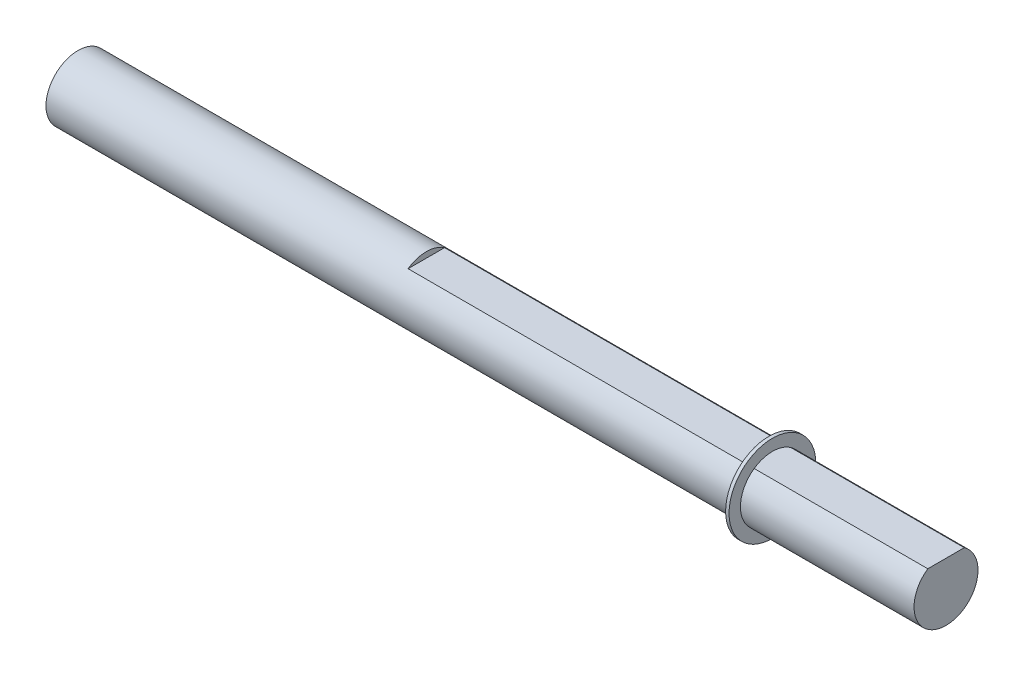
ISO-10303-21;
HEADER;
FILE_DESCRIPTION(('STEP AP214'),'2;1');
FILE_NAME('part.step','',(''),(''),'','','');
FILE_SCHEMA(('AUTOMOTIVE_DESIGN { 1 0 10303 214 1 1 1 1 }'));
ENDSEC;
DATA;
#1=APPLICATION_CONTEXT('core data for automotive mechanical design processes');
#2=APPLICATION_PROTOCOL_DEFINITION('international standard','automotive_design',2000,#1);
#3=PRODUCT_CONTEXT('',#1,'mechanical');
#4=PRODUCT('Part','Part','',(#3));
#5=PRODUCT_RELATED_PRODUCT_CATEGORY('part','',(#4));
#6=PRODUCT_DEFINITION_FORMATION('','',#4);
#7=PRODUCT_DEFINITION_CONTEXT('part definition',#1,'design');
#8=PRODUCT_DEFINITION('design','',#6,#7);
#9=PRODUCT_DEFINITION_SHAPE('','',#8);
#10=(LENGTH_UNIT() NAMED_UNIT(*) SI_UNIT(.MILLI.,.METRE.));
#11=(NAMED_UNIT(*) PLANE_ANGLE_UNIT() SI_UNIT($,.RADIAN.));
#12=(NAMED_UNIT(*) SI_UNIT($,.STERADIAN.) SOLID_ANGLE_UNIT());
#13=UNCERTAINTY_MEASURE_WITH_UNIT(LENGTH_MEASURE(1.E-05),#10,'distance_accuracy_value','');
#14=(GEOMETRIC_REPRESENTATION_CONTEXT(3) GLOBAL_UNCERTAINTY_ASSIGNED_CONTEXT((#13)) GLOBAL_UNIT_ASSIGNED_CONTEXT((#10,
#11,#12)) REPRESENTATION_CONTEXT('',''));
#15=CARTESIAN_POINT('',(0.,0.,0.));
#16=DIRECTION('',(0.,0.,1.));
#17=DIRECTION('',(1.,0.,0.));
#18=AXIS2_PLACEMENT_3D('',#15,#16,#17);
#19=CARTESIAN_POINT('',(0.,0.,0.));
#20=DIRECTION('',(1.,0.,0.));
#21=DIRECTION('',(0.,0.,-1.));
#22=AXIS2_PLACEMENT_3D('',#19,#20,#21);
#23=PLANE('',#22);
#24=CARTESIAN_POINT('',(0.,0.,0.));
#25=DIRECTION('',(-1.,0.,0.));
#26=DIRECTION('',(0.,0.,1.));
#27=AXIS2_PLACEMENT_3D('',#24,#25,#26);
#28=CIRCLE('',#27,2.8);
#29=CARTESIAN_POINT('',(0.,0.,2.8));
#30=VERTEX_POINT('',#29);
#31=EDGE_CURVE('E12',#30,#30,#28,.T.);
#32=ORIENTED_EDGE('',*,*,#31,.T.);
#33=EDGE_LOOP('',(#32));
#34=FACE_BOUND('',#33,.T.);
#35=ADVANCED_FACE('F41',(#34),#23,.F.);
#36=CARTESIAN_POINT('',(0.,0.,0.));
#37=DIRECTION('',(-1.,0.,0.));
#38=DIRECTION('',(0.,0.,1.));
#39=AXIS2_PLACEMENT_3D('',#36,#37,#38);
#40=CYLINDRICAL_SURFACE('',#39,2.8);
#41=CARTESIAN_POINT('',(60.5,0.,0.));
#42=DIRECTION('',(-1.,0.,0.));
#43=DIRECTION('',(0.,0.,1.));
#44=AXIS2_PLACEMENT_3D('',#41,#42,#43);
#45=CIRCLE('',#44,2.8);
#46=CARTESIAN_POINT('',(60.5,2.3,-1.59687194226713));
#47=VERTEX_POINT('',#46);
#48=CARTESIAN_POINT('',(60.5,2.3,1.59687194226713));
#49=VERTEX_POINT('',#48);
#50=EDGE_CURVE('E121',#47,#49,#45,.T.);
#51=ORIENTED_EDGE('',*,*,#50,.T.);
#52=DIRECTION('',(1.,0.,0.));
#53=VECTOR('',#52,1.);
#54=CARTESIAN_POINT('',(-3.23264597504892,2.3,1.59687194226713));
#55=LINE('',#54,#53);
#56=CARTESIAN_POINT('',(30.5,2.3,1.59687194226713));
#57=VERTEX_POINT('',#56);
#58=EDGE_CURVE('E56',#57,#49,#55,.T.);
#59=ORIENTED_EDGE('',*,*,#58,.F.);
#60=CARTESIAN_POINT('',(30.5,0.,0.));
#61=DIRECTION('',(1.,0.,0.));
#62=DIRECTION('',(0.,0.,-1.));
#63=AXIS2_PLACEMENT_3D('',#60,#61,#62);
#64=CIRCLE('',#63,2.8);
#65=CARTESIAN_POINT('',(30.5,2.3,-1.59687194226713));
#66=VERTEX_POINT('',#65);
#67=EDGE_CURVE('E109',#57,#66,#64,.F.);
#68=ORIENTED_EDGE('',*,*,#67,.T.);
#69=DIRECTION('',(1.,0.,0.));
#70=VECTOR('',#69,1.);
#71=CARTESIAN_POINT('',(-3.23264597504892,2.3,-1.59687194226713));
#72=LINE('',#71,#70);
#73=EDGE_CURVE('E100',#66,#47,#72,.T.);
#74=ORIENTED_EDGE('',*,*,#73,.T.);
#75=EDGE_LOOP('',(#51,#59,#68,#74));
#76=FACE_BOUND('',#75,.T.);
#77=ORIENTED_EDGE('',*,*,#31,.F.);
#78=EDGE_LOOP('',(#77));
#79=FACE_BOUND('',#78,.T.);
#80=ADVANCED_FACE('F130',(#76,#79),#40,.T.);
#81=CARTESIAN_POINT('',(60.5,3.8,0.));
#82=DIRECTION('',(1.,0.,0.));
#83=DIRECTION('',(0.,0.,-1.));
#84=AXIS2_PLACEMENT_3D('',#81,#82,#83);
#85=PLANE('',#84);
#86=EDGE_CURVE('E49',#49,#47,#45,.T.);
#87=ORIENTED_EDGE('',*,*,#86,.F.);
#88=ORIENTED_EDGE('',*,*,#50,.F.);
#89=EDGE_LOOP('',(#87,#88));
#90=FACE_BOUND('',#89,.T.);
#91=CARTESIAN_POINT('',(60.5,0.,0.));
#92=DIRECTION('',(-1.,0.,0.));
#93=DIRECTION('',(0.,0.,1.));
#94=AXIS2_PLACEMENT_3D('',#91,#92,#93);
#95=CIRCLE('',#94,3.8);
#96=CARTESIAN_POINT('',(60.5,0.,3.8));
#97=VERTEX_POINT('',#96);
#98=EDGE_CURVE('E118',#97,#97,#95,.T.);
#99=ORIENTED_EDGE('',*,*,#98,.T.);
#100=EDGE_LOOP('',(#99));
#101=FACE_BOUND('',#100,.T.);
#102=ADVANCED_FACE('F134',(#90,#101),#85,.F.);
#103=CARTESIAN_POINT('',(0.,0.,0.));
#104=DIRECTION('',(-1.,0.,0.));
#105=DIRECTION('',(0.,0.,1.));
#106=AXIS2_PLACEMENT_3D('',#103,#104,#105);
#107=CYLINDRICAL_SURFACE('',#106,3.8);
#108=ORIENTED_EDGE('',*,*,#98,.F.);
#109=EDGE_LOOP('',(#108));
#110=FACE_BOUND('',#109,.T.);
#111=CARTESIAN_POINT('',(60.8,0.,0.));
#112=DIRECTION('',(-1.,0.,0.));
#113=DIRECTION('',(0.,0.,1.));
#114=AXIS2_PLACEMENT_3D('',#111,#112,#113);
#115=CIRCLE('',#114,3.8);
#116=CARTESIAN_POINT('',(60.8,0.,3.8));
#117=VERTEX_POINT('',#116);
#118=EDGE_CURVE('E114',#117,#117,#115,.T.);
#119=ORIENTED_EDGE('',*,*,#118,.T.);
#120=EDGE_LOOP('',(#119));
#121=FACE_BOUND('',#120,.T.);
#122=ADVANCED_FACE('F137',(#110,#121),#107,.T.);
#123=CARTESIAN_POINT('',(60.8,2.8,0.));
#124=DIRECTION('',(-1.,0.,0.));
#125=DIRECTION('',(0.,0.,1.));
#126=AXIS2_PLACEMENT_3D('',#123,#124,#125);
#127=PLANE('',#126);
#128=ORIENTED_EDGE('',*,*,#118,.F.);
#129=EDGE_LOOP('',(#128));
#130=FACE_BOUND('',#129,.T.);
#131=CARTESIAN_POINT('',(60.8,0.,0.));
#132=DIRECTION('',(-1.,0.,0.));
#133=DIRECTION('',(0.,0.,1.));
#134=AXIS2_PLACEMENT_3D('',#131,#132,#133);
#135=CIRCLE('',#134,2.8);
#136=CARTESIAN_POINT('',(60.8,2.3,1.59687194226713));
#137=VERTEX_POINT('',#136);
#138=CARTESIAN_POINT('',(60.8,2.3,-1.59687194226713));
#139=VERTEX_POINT('',#138);
#140=EDGE_CURVE('E107',#137,#139,#135,.T.);
#141=ORIENTED_EDGE('',*,*,#140,.T.);
#142=EDGE_CURVE('E95',#139,#137,#135,.T.);
#143=ORIENTED_EDGE('',*,*,#142,.T.);
#144=EDGE_LOOP('',(#141,#143));
#145=FACE_BOUND('',#144,.T.);
#146=ADVANCED_FACE('F143',(#130,#145),#127,.F.);
#147=CARTESIAN_POINT('',(0.,0.,0.));
#148=DIRECTION('',(-1.,0.,0.));
#149=DIRECTION('',(0.,0.,1.));
#150=AXIS2_PLACEMENT_3D('',#147,#148,#149);
#151=CYLINDRICAL_SURFACE('',#150,2.8);
#152=CARTESIAN_POINT('',(76.,0.,0.));
#153=DIRECTION('',(-1.,0.,0.));
#154=DIRECTION('',(0.,0.,1.));
#155=AXIS2_PLACEMENT_3D('',#152,#153,#154);
#156=CIRCLE('',#155,2.8);
#157=CARTESIAN_POINT('',(76.,2.3,-1.59687194226713));
#158=VERTEX_POINT('',#157);
#159=CARTESIAN_POINT('',(76.,2.3,1.59687194226713));
#160=VERTEX_POINT('',#159);
#161=EDGE_CURVE('E93',#158,#160,#156,.T.);
#162=ORIENTED_EDGE('',*,*,#161,.T.);
#163=EDGE_CURVE('E62',#137,#160,#55,.T.);
#164=ORIENTED_EDGE('',*,*,#163,.F.);
#165=ORIENTED_EDGE('',*,*,#142,.F.);
#166=EDGE_CURVE('E83',#139,#158,#72,.T.);
#167=ORIENTED_EDGE('',*,*,#166,.T.);
#168=EDGE_LOOP('',(#162,#164,#165,#167));
#169=FACE_BOUND('',#168,.T.);
#170=ADVANCED_FACE('F92',(#169),#151,.T.);
#171=CARTESIAN_POINT('',(76.,0.,0.));
#172=DIRECTION('',(-1.,0.,0.));
#173=DIRECTION('',(0.,0.,1.));
#174=AXIS2_PLACEMENT_3D('',#171,#172,#173);
#175=PLANE('',#174);
#176=ORIENTED_EDGE('',*,*,#161,.F.);
#177=DIRECTION('',(0.,0.,-1.));
#178=VECTOR('',#177,1.);
#179=CARTESIAN_POINT('',(76.,2.3,1.59687194226713));
#180=LINE('',#179,#178);
#181=EDGE_CURVE('E79',#160,#158,#180,.T.);
#182=ORIENTED_EDGE('',*,*,#181,.F.);
#183=EDGE_LOOP('',(#176,#182));
#184=FACE_BOUND('',#183,.T.);
#185=ADVANCED_FACE('F101',(#184),#175,.F.);
#186=CARTESIAN_POINT('',(-3.23264597504892,0.,0.));
#187=DIRECTION('',(1.,0.,0.));
#188=DIRECTION('',(0.,0.,-1.));
#189=AXIS2_PLACEMENT_3D('',#186,#187,#188);
#190=CYLINDRICAL_SURFACE('',#189,2.8);
#191=EDGE_CURVE('E98',#47,#139,#72,.T.);
#192=ORIENTED_EDGE('',*,*,#191,.T.);
#193=ORIENTED_EDGE('',*,*,#140,.F.);
#194=EDGE_CURVE('E151',#49,#137,#55,.T.);
#195=ORIENTED_EDGE('',*,*,#194,.F.);
#196=ORIENTED_EDGE('',*,*,#86,.T.);
#197=EDGE_LOOP('',(#192,#193,#195,#196));
#198=FACE_BOUND('',#197,.T.);
#199=ADVANCED_FACE('F150',(#198),#190,.F.);
#200=CARTESIAN_POINT('',(-3.23264597504892,2.3,1.59687194226713));
#201=DIRECTION('',(0.,-1.,0.));
#202=DIRECTION('',(0.,0.,-1.));
#203=AXIS2_PLACEMENT_3D('',#200,#201,#202);
#204=PLANE('',#203);
#205=DIRECTION('',(0.,0.,1.));
#206=VECTOR('',#205,1.);
#207=CARTESIAN_POINT('',(30.5,2.3,1.59687194226713));
#208=LINE('',#207,#206);
#209=EDGE_CURVE('E103',#66,#57,#208,.T.);
#210=ORIENTED_EDGE('',*,*,#209,.T.);
#211=ORIENTED_EDGE('',*,*,#58,.T.);
#212=ORIENTED_EDGE('',*,*,#194,.T.);
#213=ORIENTED_EDGE('',*,*,#163,.T.);
#214=ORIENTED_EDGE('',*,*,#181,.T.);
#215=ORIENTED_EDGE('',*,*,#166,.F.);
#216=ORIENTED_EDGE('',*,*,#191,.F.);
#217=ORIENTED_EDGE('',*,*,#73,.F.);
#218=EDGE_LOOP('',(#210,#211,#212,#213,#214,#215,#216,#217));
#219=FACE_BOUND('',#218,.T.);
#220=ADVANCED_FACE('F81',(#219),#204,.F.);
#221=CARTESIAN_POINT('',(30.5,0.,0.));
#222=DIRECTION('',(1.,0.,0.));
#223=DIRECTION('',(0.,0.,-1.));
#224=AXIS2_PLACEMENT_3D('',#221,#222,#223);
#225=PLANE('',#224);
#226=ORIENTED_EDGE('',*,*,#67,.F.);
#227=ORIENTED_EDGE('',*,*,#209,.F.);
#228=EDGE_LOOP('',(#226,#227));
#229=FACE_BOUND('',#228,.T.);
#230=ADVANCED_FACE('F162',(#229),#225,.T.);
#231=CLOSED_SHELL('',(#35,#80,#102,#122,#146,#170,#185,#199,#220,#230));
#232=MANIFOLD_SOLID_BREP('B2',#231);
#233=ADVANCED_BREP_SHAPE_REPRESENTATION('',(#18,#232),#14);
#234=SHAPE_DEFINITION_REPRESENTATION(#9,#233);
ENDSEC;
END-ISO-10303-21;
